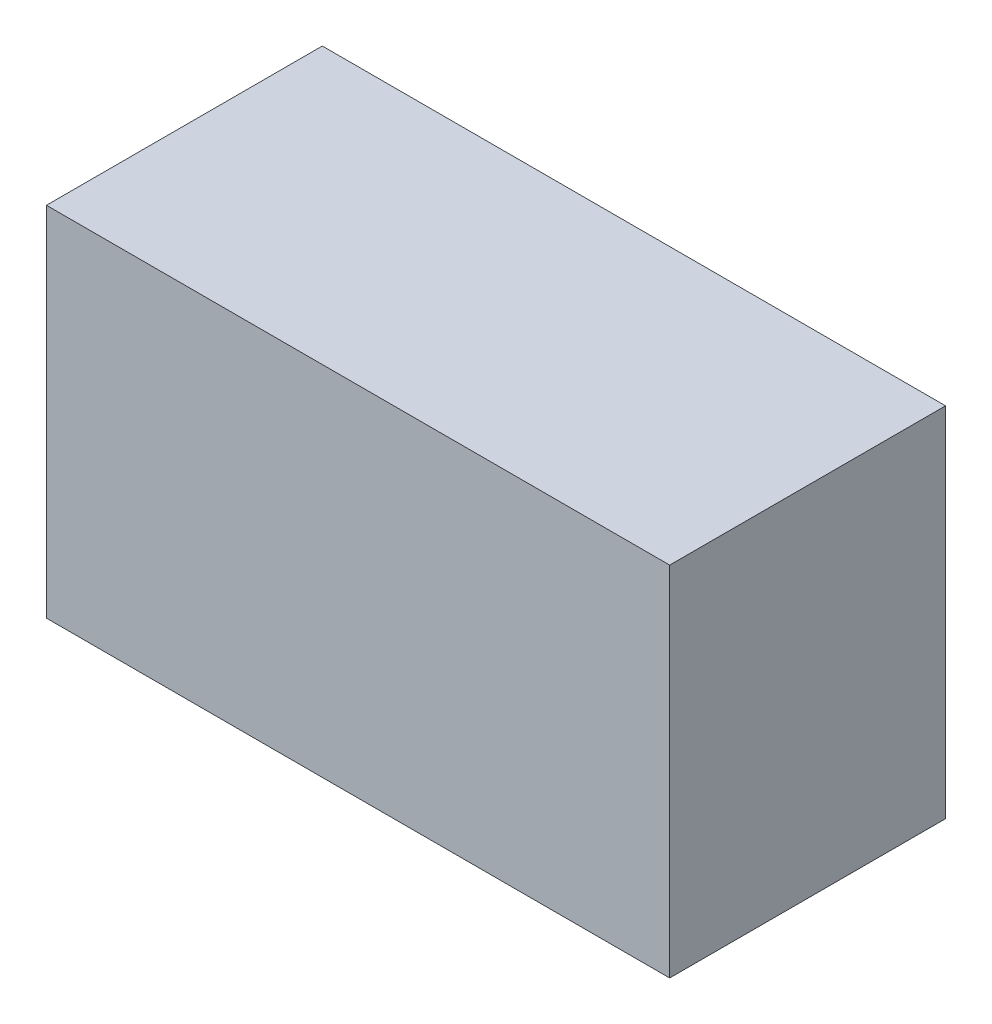
ISO-10303-21;
HEADER;
FILE_DESCRIPTION(('STEP AP214'),'2;1');
FILE_NAME('part.step','',(''),(''),'','','');
FILE_SCHEMA(('AUTOMOTIVE_DESIGN { 1 0 10303 214 1 1 1 1 }'));
ENDSEC;
DATA;
#1=APPLICATION_CONTEXT('core data for automotive mechanical design processes');
#2=APPLICATION_PROTOCOL_DEFINITION('international standard','automotive_design',2000,#1);
#3=PRODUCT_CONTEXT('',#1,'mechanical');
#4=PRODUCT('Part','Part','',(#3));
#5=PRODUCT_RELATED_PRODUCT_CATEGORY('part','',(#4));
#6=PRODUCT_DEFINITION_FORMATION('','',#4);
#7=PRODUCT_DEFINITION_CONTEXT('part definition',#1,'design');
#8=PRODUCT_DEFINITION('design','',#6,#7);
#9=PRODUCT_DEFINITION_SHAPE('','',#8);
#10=(LENGTH_UNIT() NAMED_UNIT(*) SI_UNIT(.MILLI.,.METRE.));
#11=(NAMED_UNIT(*) PLANE_ANGLE_UNIT() SI_UNIT($,.RADIAN.));
#12=(NAMED_UNIT(*) SI_UNIT($,.STERADIAN.) SOLID_ANGLE_UNIT());
#13=UNCERTAINTY_MEASURE_WITH_UNIT(LENGTH_MEASURE(1.E-05),#10,'distance_accuracy_value','');
#14=(GEOMETRIC_REPRESENTATION_CONTEXT(3) GLOBAL_UNCERTAINTY_ASSIGNED_CONTEXT((#13)) GLOBAL_UNIT_ASSIGNED_CONTEXT((#10,
#11,#12)) REPRESENTATION_CONTEXT('',''));
#15=CARTESIAN_POINT('',(0.,0.,0.));
#16=DIRECTION('',(0.,0.,1.));
#17=DIRECTION('',(1.,0.,0.));
#18=AXIS2_PLACEMENT_3D('',#15,#16,#17);
#19=CARTESIAN_POINT('',(-1.52499822,-0.87499952,1.34999984));
#20=DIRECTION('',(0.,0.,-1.));
#21=DIRECTION('',(-1.,0.,0.));
#22=AXIS2_PLACEMENT_3D('',#19,#20,#21);
#23=PLANE('',#22);
#24=DIRECTION('',(0.,1.,0.));
#25=VECTOR('',#24,1.);
#26=CARTESIAN_POINT('',(1.52500076,-0.87499952,1.34999984));
#27=LINE('',#26,#25);
#28=CARTESIAN_POINT('',(1.52500076,-0.87499952,1.34999984));
#29=VERTEX_POINT('',#28);
#30=CARTESIAN_POINT('',(1.52500076,0.87500206,1.34999984));
#31=VERTEX_POINT('',#30);
#32=EDGE_CURVE('E55',#29,#31,#27,.T.);
#33=ORIENTED_EDGE('',*,*,#32,.T.);
#34=DIRECTION('',(1.,0.,0.));
#35=VECTOR('',#34,1.);
#36=CARTESIAN_POINT('',(1.52500076,0.87500206,1.34999984));
#37=LINE('',#36,#35);
#38=CARTESIAN_POINT('',(-1.52499822,0.87500206,1.34999984));
#39=VERTEX_POINT('',#38);
#40=EDGE_CURVE('E57',#31,#39,#37,.F.);
#41=ORIENTED_EDGE('',*,*,#40,.T.);
#42=DIRECTION('',(0.,1.,0.));
#43=VECTOR('',#42,1.);
#44=CARTESIAN_POINT('',(-1.52499822,0.87500206,1.34999984));
#45=LINE('',#44,#43);
#46=CARTESIAN_POINT('',(-1.52499822,-0.87499952,1.34999984));
#47=VERTEX_POINT('',#46);
#48=EDGE_CURVE('E20',#39,#47,#45,.F.);
#49=ORIENTED_EDGE('',*,*,#48,.T.);
#50=DIRECTION('',(1.,0.,0.));
#51=VECTOR('',#50,1.);
#52=CARTESIAN_POINT('',(-1.52499822,-0.87499952,1.34999984));
#53=LINE('',#52,#51);
#54=EDGE_CURVE('E80',#47,#29,#53,.T.);
#55=ORIENTED_EDGE('',*,*,#54,.T.);
#56=EDGE_LOOP('',(#33,#41,#49,#55));
#57=FACE_BOUND('',#56,.T.);
#58=ADVANCED_FACE('F17',(#57),#23,.F.);
#59=CARTESIAN_POINT('',(-1.52499822,0.87500206,0.));
#60=DIRECTION('',(1.,0.,0.));
#61=DIRECTION('',(0.,0.,-1.));
#62=AXIS2_PLACEMENT_3D('',#59,#60,#61);
#63=PLANE('',#62);
#64=DIRECTION('',(0.,0.,1.));
#65=VECTOR('',#64,1.);
#66=CARTESIAN_POINT('',(-1.52499822,-0.87499952,0.));
#67=LINE('',#66,#65);
#68=CARTESIAN_POINT('',(-1.52499822,-0.87499952,0.));
#69=VERTEX_POINT('',#68);
#70=EDGE_CURVE('E68',#69,#47,#67,.T.);
#71=ORIENTED_EDGE('',*,*,#70,.T.);
#72=ORIENTED_EDGE('',*,*,#48,.F.);
#73=DIRECTION('',(0.,0.,-1.));
#74=VECTOR('',#73,1.);
#75=CARTESIAN_POINT('',(-1.52499822,0.87500206,0.));
#76=LINE('',#75,#74);
#77=CARTESIAN_POINT('',(-1.52499822,0.87500206,0.));
#78=VERTEX_POINT('',#77);
#79=EDGE_CURVE('E63',#39,#78,#76,.T.);
#80=ORIENTED_EDGE('',*,*,#79,.T.);
#81=DIRECTION('',(0.,1.,0.));
#82=VECTOR('',#81,1.);
#83=CARTESIAN_POINT('',(-1.52499822,-0.87499952,0.));
#84=LINE('',#83,#82);
#85=EDGE_CURVE('E83',#69,#78,#84,.T.);
#86=ORIENTED_EDGE('',*,*,#85,.F.);
#87=EDGE_LOOP('',(#71,#72,#80,#86));
#88=FACE_BOUND('',#87,.T.);
#89=ADVANCED_FACE('F65',(#88),#63,.F.);
#90=CARTESIAN_POINT('',(1.52500076,0.87500206,0.));
#91=DIRECTION('',(0.,-1.,0.));
#92=DIRECTION('',(0.,0.,-1.));
#93=AXIS2_PLACEMENT_3D('',#90,#91,#92);
#94=PLANE('',#93);
#95=ORIENTED_EDGE('',*,*,#79,.F.);
#96=ORIENTED_EDGE('',*,*,#40,.F.);
#97=DIRECTION('',(0.,0.,1.));
#98=VECTOR('',#97,1.);
#99=CARTESIAN_POINT('',(1.52500076,0.87500206,0.));
#100=LINE('',#99,#98);
#101=CARTESIAN_POINT('',(1.52500076,0.87500206,0.));
#102=VERTEX_POINT('',#101);
#103=EDGE_CURVE('E75',#31,#102,#100,.F.);
#104=ORIENTED_EDGE('',*,*,#103,.T.);
#105=DIRECTION('',(-1.,0.,0.));
#106=VECTOR('',#105,1.);
#107=CARTESIAN_POINT('',(-1.52499822,0.87500206,0.));
#108=LINE('',#107,#106);
#109=EDGE_CURVE('E72',#78,#102,#108,.F.);
#110=ORIENTED_EDGE('',*,*,#109,.F.);
#111=EDGE_LOOP('',(#95,#96,#104,#110));
#112=FACE_BOUND('',#111,.T.);
#113=ADVANCED_FACE('F70',(#112),#94,.F.);
#114=CARTESIAN_POINT('',(1.52500076,-0.87499952,0.));
#115=DIRECTION('',(-1.,0.,0.));
#116=DIRECTION('',(0.,0.,1.));
#117=AXIS2_PLACEMENT_3D('',#114,#115,#116);
#118=PLANE('',#117);
#119=ORIENTED_EDGE('',*,*,#103,.F.);
#120=ORIENTED_EDGE('',*,*,#32,.F.);
#121=DIRECTION('',(0.,0.,1.));
#122=VECTOR('',#121,1.);
#123=CARTESIAN_POINT('',(1.52500076,-0.87499952,0.));
#124=LINE('',#123,#122);
#125=CARTESIAN_POINT('',(1.52500076,-0.87499952,0.));
#126=VERTEX_POINT('',#125);
#127=EDGE_CURVE('E35',#29,#126,#124,.F.);
#128=ORIENTED_EDGE('',*,*,#127,.T.);
#129=DIRECTION('',(0.,1.,0.));
#130=VECTOR('',#129,1.);
#131=CARTESIAN_POINT('',(1.52500076,-0.87499952,0.));
#132=LINE('',#131,#130);
#133=EDGE_CURVE('E26',#102,#126,#132,.F.);
#134=ORIENTED_EDGE('',*,*,#133,.F.);
#135=EDGE_LOOP('',(#119,#120,#128,#134));
#136=FACE_BOUND('',#135,.T.);
#137=ADVANCED_FACE('F89',(#136),#118,.F.);
#138=CARTESIAN_POINT('',(-1.52499822,-0.87499952,0.));
#139=DIRECTION('',(0.,1.,0.));
#140=DIRECTION('',(0.,0.,1.));
#141=AXIS2_PLACEMENT_3D('',#138,#139,#140);
#142=PLANE('',#141);
#143=ORIENTED_EDGE('',*,*,#127,.F.);
#144=ORIENTED_EDGE('',*,*,#54,.F.);
#145=ORIENTED_EDGE('',*,*,#70,.F.);
#146=DIRECTION('',(-1.,0.,0.));
#147=VECTOR('',#146,1.);
#148=CARTESIAN_POINT('',(-1.52499822,-0.87499952,0.));
#149=LINE('',#148,#147);
#150=EDGE_CURVE('E11',#126,#69,#149,.T.);
#151=ORIENTED_EDGE('',*,*,#150,.F.);
#152=EDGE_LOOP('',(#143,#144,#145,#151));
#153=FACE_BOUND('',#152,.T.);
#154=ADVANCED_FACE('F91',(#153),#142,.F.);
#155=CARTESIAN_POINT('',(-1.52499822,-0.87499952,0.));
#156=DIRECTION('',(0.,0.,-1.));
#157=DIRECTION('',(-1.,0.,0.));
#158=AXIS2_PLACEMENT_3D('',#155,#156,#157);
#159=PLANE('',#158);
#160=ORIENTED_EDGE('',*,*,#133,.T.);
#161=ORIENTED_EDGE('',*,*,#150,.T.);
#162=ORIENTED_EDGE('',*,*,#85,.T.);
#163=ORIENTED_EDGE('',*,*,#109,.T.);
#164=EDGE_LOOP('',(#160,#161,#162,#163));
#165=FACE_BOUND('',#164,.T.);
#166=ADVANCED_FACE('F88',(#165),#159,.T.);
#167=CLOSED_SHELL('',(#58,#89,#113,#137,#154,#166));
#168=MANIFOLD_SOLID_BREP('B1',#167);
#169=ADVANCED_BREP_SHAPE_REPRESENTATION('',(#18,#168),#14);
#170=SHAPE_DEFINITION_REPRESENTATION(#9,#169);
ENDSEC;
END-ISO-10303-21;
